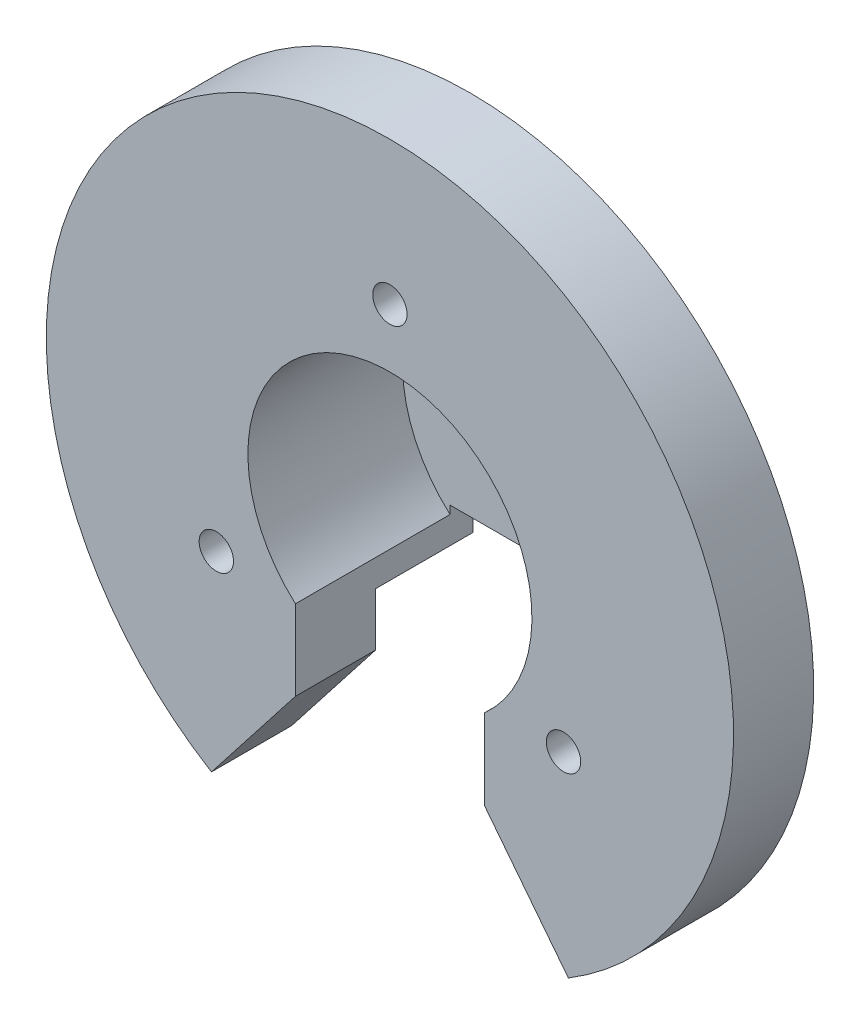
ISO-10303-21;
HEADER;
FILE_DESCRIPTION(('STEP AP214'),'2;1');
FILE_NAME('part.step','',(''),(''),'','','');
FILE_SCHEMA(('AUTOMOTIVE_DESIGN { 1 0 10303 214 1 1 1 1 }'));
ENDSEC;
DATA;
#1=APPLICATION_CONTEXT('core data for automotive mechanical design processes');
#2=APPLICATION_PROTOCOL_DEFINITION('international standard','automotive_design',2000,#1);
#3=PRODUCT_CONTEXT('',#1,'mechanical');
#4=PRODUCT('Part','Part','',(#3));
#5=PRODUCT_RELATED_PRODUCT_CATEGORY('part','',(#4));
#6=PRODUCT_DEFINITION_FORMATION('','',#4);
#7=PRODUCT_DEFINITION_CONTEXT('part definition',#1,'design');
#8=PRODUCT_DEFINITION('design','',#6,#7);
#9=PRODUCT_DEFINITION_SHAPE('','',#8);
#10=(LENGTH_UNIT() NAMED_UNIT(*) SI_UNIT(.MILLI.,.METRE.));
#11=(NAMED_UNIT(*) PLANE_ANGLE_UNIT() SI_UNIT($,.RADIAN.));
#12=(NAMED_UNIT(*) SI_UNIT($,.STERADIAN.) SOLID_ANGLE_UNIT());
#13=UNCERTAINTY_MEASURE_WITH_UNIT(LENGTH_MEASURE(1.E-05),#10,'distance_accuracy_value','');
#14=(GEOMETRIC_REPRESENTATION_CONTEXT(3) GLOBAL_UNCERTAINTY_ASSIGNED_CONTEXT((#13)) GLOBAL_UNIT_ASSIGNED_CONTEXT((#10,
#11,#12)) REPRESENTATION_CONTEXT('',''));
#15=CARTESIAN_POINT('',(0.,0.,0.));
#16=DIRECTION('',(0.,0.,1.));
#17=DIRECTION('',(1.,0.,0.));
#18=AXIS2_PLACEMENT_3D('',#15,#16,#17);
#19=CARTESIAN_POINT('',(0.,0.,13.5));
#20=DIRECTION('',(0.,0.,-1.));
#21=DIRECTION('',(-1.,0.,0.));
#22=AXIS2_PLACEMENT_3D('',#19,#20,#21);
#23=CYLINDRICAL_SURFACE('',#22,14.25);
#24=DIRECTION('',(0.,0.,-1.));
#25=VECTOR('',#24,1.);
#26=CARTESIAN_POINT('',(-8.25,-11.6189500386223,13.5));
#27=LINE('',#26,#25);
#28=CARTESIAN_POINT('',(-8.25,-11.6189500386223,6.5));
#29=VERTEX_POINT('',#28);
#30=CARTESIAN_POINT('',(-8.25,-11.6189500386223,-2.));
#31=VERTEX_POINT('',#30);
#32=EDGE_CURVE('E118',#29,#31,#27,.T.);
#33=ORIENTED_EDGE('',*,*,#32,.F.);
#34=CARTESIAN_POINT('',(0.,0.,6.5));
#35=DIRECTION('',(0.,0.,1.));
#36=DIRECTION('',(-1.,0.,0.));
#37=AXIS2_PLACEMENT_3D('',#34,#35,#36);
#38=CIRCLE('',#37,14.25);
#39=CARTESIAN_POINT('',(8.25,-11.6189500386223,6.5));
#40=VERTEX_POINT('',#39);
#41=EDGE_CURVE('E126',#40,#29,#38,.T.);
#42=ORIENTED_EDGE('',*,*,#41,.F.);
#43=DIRECTION('',(0.,0.,-1.));
#44=VECTOR('',#43,1.);
#45=CARTESIAN_POINT('',(8.25,-11.6189500386223,13.5));
#46=LINE('',#45,#44);
#47=CARTESIAN_POINT('',(8.25,-11.6189500386223,-2.));
#48=VERTEX_POINT('',#47);
#49=EDGE_CURVE('E159',#48,#40,#46,.F.);
#50=ORIENTED_EDGE('',*,*,#49,.F.);
#51=CARTESIAN_POINT('',(0.,0.,-2.));
#52=DIRECTION('',(0.,0.,-1.));
#53=DIRECTION('',(-1.,0.,0.));
#54=AXIS2_PLACEMENT_3D('',#51,#52,#53);
#55=CIRCLE('',#54,14.25);
#56=EDGE_CURVE('E141',#31,#48,#55,.T.);
#57=ORIENTED_EDGE('',*,*,#56,.F.);
#58=EDGE_LOOP('',(#33,#42,#50,#57));
#59=FACE_BOUND('',#58,.T.);
#60=ADVANCED_FACE('F40',(#59),#23,.T.);
#61=CARTESIAN_POINT('',(0.,0.,13.5));
#62=DIRECTION('',(0.,0.,1.));
#63=DIRECTION('',(1.,0.,0.));
#64=AXIS2_PLACEMENT_3D('',#61,#62,#63);
#65=PLANE('',#64);
#66=CARTESIAN_POINT('',(0.,17.5,13.5));
#67=DIRECTION('',(0.,0.,1.));
#68=DIRECTION('',(1.,0.,0.));
#69=AXIS2_PLACEMENT_3D('',#66,#67,#68);
#70=CIRCLE('',#69,1.5);
#71=CARTESIAN_POINT('',(1.5,17.5,13.5));
#72=VERTEX_POINT('',#71);
#73=EDGE_CURVE('E216',#72,#72,#70,.T.);
#74=ORIENTED_EDGE('',*,*,#73,.F.);
#75=EDGE_LOOP('',(#74));
#76=FACE_BOUND('',#75,.T.);
#77=CARTESIAN_POINT('',(15.1554445662288,-8.74999999999936,13.5));
#78=DIRECTION('',(0.,0.,1.));
#79=DIRECTION('',(1.,0.,0.));
#80=AXIS2_PLACEMENT_3D('',#77,#78,#79);
#81=CIRCLE('',#80,1.50000000000096);
#82=CARTESIAN_POINT('',(16.6554445662298,-8.74999999999936,13.5));
#83=VERTEX_POINT('',#82);
#84=EDGE_CURVE('E220',#83,#83,#81,.T.);
#85=ORIENTED_EDGE('',*,*,#84,.F.);
#86=EDGE_LOOP('',(#85));
#87=FACE_BOUND('',#86,.T.);
#88=CARTESIAN_POINT('',(-15.1554445662266,-8.75000000000065,13.5));
#89=DIRECTION('',(0.,0.,1.));
#90=DIRECTION('',(1.,0.,0.));
#91=AXIS2_PLACEMENT_3D('',#88,#89,#90);
#92=CIRCLE('',#91,1.50000000000141);
#93=CARTESIAN_POINT('',(-13.6554445662251,-8.75000000000065,13.5));
#94=VERTEX_POINT('',#93);
#95=EDGE_CURVE('E217',#94,#94,#92,.T.);
#96=ORIENTED_EDGE('',*,*,#95,.F.);
#97=EDGE_LOOP('',(#96));
#98=FACE_BOUND('',#97,.T.);
#99=DIRECTION('',(0.615661475325654,0.788010753606726,0.));
#100=VECTOR('',#99,1.);
#101=CARTESIAN_POINT('',(2.76358777565575,-2.15915140670948,13.5));
#102=LINE('',#101,#100);
#103=CARTESIAN_POINT('',(-15.5796183831118,-25.6373846372169,13.5));
#104=VERTEX_POINT('',#103);
#105=CARTESIAN_POINT('',(-8.25,-16.2559009205842,13.5));
#106=VERTEX_POINT('',#105);
#107=EDGE_CURVE('E143',#104,#106,#102,.T.);
#108=ORIENTED_EDGE('',*,*,#107,.T.);
#109=DIRECTION('',(0.,1.,0.));
#110=VECTOR('',#109,1.);
#111=CARTESIAN_POINT('',(-8.25,0.,13.5));
#112=LINE('',#111,#110);
#113=CARTESIAN_POINT('',(-8.25,-9.25729442115784,13.5));
#114=VERTEX_POINT('',#113);
#115=EDGE_CURVE('E156',#106,#114,#112,.T.);
#116=ORIENTED_EDGE('',*,*,#115,.T.);
#117=CARTESIAN_POINT('',(0.,0.,13.5));
#118=DIRECTION('',(0.,0.,1.));
#119=DIRECTION('',(1.,0.,0.));
#120=AXIS2_PLACEMENT_3D('',#117,#118,#119);
#121=CIRCLE('',#120,12.4);
#122=CARTESIAN_POINT('',(8.25,-9.25729442115784,13.5));
#123=VERTEX_POINT('',#122);
#124=EDGE_CURVE('E187',#123,#114,#121,.T.);
#125=ORIENTED_EDGE('',*,*,#124,.F.);
#126=DIRECTION('',(0.,-1.,0.));
#127=VECTOR('',#126,1.);
#128=CARTESIAN_POINT('',(8.25,0.,13.5));
#129=LINE('',#128,#127);
#130=CARTESIAN_POINT('',(8.25,-16.2559009205842,13.5));
#131=VERTEX_POINT('',#130);
#132=EDGE_CURVE('E54',#123,#131,#129,.T.);
#133=ORIENTED_EDGE('',*,*,#132,.T.);
#134=DIRECTION('',(0.61566147532566,-0.788010753606721,0.));
#135=VECTOR('',#134,1.);
#136=CARTESIAN_POINT('',(-2.76358777565584,-2.15915140670958,13.5));
#137=LINE('',#136,#135);
#138=CARTESIAN_POINT('',(15.5796183831119,-25.6373846372168,13.5));
#139=VERTEX_POINT('',#138);
#140=EDGE_CURVE('E148',#131,#139,#137,.T.);
#141=ORIENTED_EDGE('',*,*,#140,.T.);
#142=CARTESIAN_POINT('',(0.,0.,13.5));
#143=DIRECTION('',(0.,0.,1.));
#144=DIRECTION('',(1.,0.,0.));
#145=AXIS2_PLACEMENT_3D('',#142,#143,#144);
#146=CIRCLE('',#145,30.);
#147=EDGE_CURVE('E170',#139,#104,#146,.T.);
#148=ORIENTED_EDGE('',*,*,#147,.T.);
#149=EDGE_LOOP('',(#108,#116,#125,#133,#141,#148));
#150=FACE_BOUND('',#149,.T.);
#151=ADVANCED_FACE('F203',(#76,#87,#98,#150),#65,.T.);
#152=CARTESIAN_POINT('',(0.,0.,13.5));
#153=DIRECTION('',(0.,0.,-1.));
#154=DIRECTION('',(-1.,0.,0.));
#155=AXIS2_PLACEMENT_3D('',#152,#153,#154);
#156=CYLINDRICAL_SURFACE('',#155,12.4);
#157=CARTESIAN_POINT('',(0.,0.,0.));
#158=DIRECTION('',(0.,0.,1.));
#159=DIRECTION('',(1.,0.,0.));
#160=AXIS2_PLACEMENT_3D('',#157,#158,#159);
#161=CIRCLE('',#160,12.4);
#162=CARTESIAN_POINT('',(8.25,-9.25729442115784,0.));
#163=VERTEX_POINT('',#162);
#164=CARTESIAN_POINT('',(-8.25,-9.25729442115784,0.));
#165=VERTEX_POINT('',#164);
#166=EDGE_CURVE('E182',#163,#165,#161,.T.);
#167=ORIENTED_EDGE('',*,*,#166,.F.);
#168=DIRECTION('',(0.,0.,-1.));
#169=VECTOR('',#168,1.);
#170=CARTESIAN_POINT('',(8.25,-9.25729442115784,13.5));
#171=LINE('',#170,#169);
#172=EDGE_CURVE('E58',#163,#123,#171,.F.);
#173=ORIENTED_EDGE('',*,*,#172,.T.);
#174=ORIENTED_EDGE('',*,*,#124,.T.);
#175=DIRECTION('',(0.,0.,-1.));
#176=VECTOR('',#175,1.);
#177=CARTESIAN_POINT('',(-8.25,-9.25729442115784,13.5));
#178=LINE('',#177,#176);
#179=EDGE_CURVE('E153',#114,#165,#178,.T.);
#180=ORIENTED_EDGE('',*,*,#179,.T.);
#181=EDGE_LOOP('',(#167,#173,#174,#180));
#182=FACE_BOUND('',#181,.T.);
#183=ADVANCED_FACE('F256',(#182),#156,.F.);
#184=CARTESIAN_POINT('',(0.,0.,0.));
#185=DIRECTION('',(0.,0.,-1.));
#186=DIRECTION('',(-1.,0.,0.));
#187=AXIS2_PLACEMENT_3D('',#184,#185,#186);
#188=PLANE('',#187);
#189=CARTESIAN_POINT('',(10.,0.,0.));
#190=DIRECTION('',(0.,0.,-1.));
#191=DIRECTION('',(-1.,0.,0.));
#192=AXIS2_PLACEMENT_3D('',#189,#190,#191);
#193=CIRCLE('',#192,1.5);
#194=CARTESIAN_POINT('',(8.5,0.,0.));
#195=VERTEX_POINT('',#194);
#196=EDGE_CURVE('E173',#195,#195,#193,.T.);
#197=ORIENTED_EDGE('',*,*,#196,.T.);
#198=EDGE_LOOP('',(#197));
#199=FACE_BOUND('',#198,.T.);
#200=CARTESIAN_POINT('',(0.,0.,0.));
#201=DIRECTION('',(0.,0.,-1.));
#202=DIRECTION('',(-1.,0.,0.));
#203=AXIS2_PLACEMENT_3D('',#200,#201,#202);
#204=CIRCLE('',#203,4.5);
#205=CARTESIAN_POINT('',(-4.5,0.,0.));
#206=VERTEX_POINT('',#205);
#207=EDGE_CURVE('E176',#206,#206,#204,.T.);
#208=ORIENTED_EDGE('',*,*,#207,.T.);
#209=EDGE_LOOP('',(#208));
#210=FACE_BOUND('',#209,.T.);
#211=DIRECTION('',(0.,1.,0.));
#212=VECTOR('',#211,1.);
#213=CARTESIAN_POINT('',(8.25,0.,0.));
#214=LINE('',#213,#212);
#215=CARTESIAN_POINT('',(8.25,-8.54409907941579,0.));
#216=VERTEX_POINT('',#215);
#217=EDGE_CURVE('E164',#163,#216,#214,.T.);
#218=ORIENTED_EDGE('',*,*,#217,.F.);
#219=ORIENTED_EDGE('',*,*,#166,.T.);
#220=DIRECTION('',(0.,-1.,0.));
#221=VECTOR('',#220,1.);
#222=CARTESIAN_POINT('',(-8.25,0.,0.));
#223=LINE('',#222,#221);
#224=CARTESIAN_POINT('',(-8.25,-8.54409907941579,0.));
#225=VERTEX_POINT('',#224);
#226=EDGE_CURVE('E145',#225,#165,#223,.T.);
#227=ORIENTED_EDGE('',*,*,#226,.F.);
#228=DIRECTION('',(-1.,0.,0.));
#229=VECTOR('',#228,1.);
#230=CARTESIAN_POINT('',(0.,-8.54409907941579,0.));
#231=LINE('',#230,#229);
#232=EDGE_CURVE('E168',#216,#225,#231,.T.);
#233=ORIENTED_EDGE('',*,*,#232,.F.);
#234=EDGE_LOOP('',(#218,#219,#227,#233));
#235=FACE_BOUND('',#234,.T.);
#236=ADVANCED_FACE('F261',(#199,#210,#235),#188,.F.);
#237=CARTESIAN_POINT('',(0.,0.,-2.));
#238=DIRECTION('',(0.,0.,-1.));
#239=DIRECTION('',(-1.,0.,0.));
#240=AXIS2_PLACEMENT_3D('',#237,#238,#239);
#241=PLANE('',#240);
#242=CARTESIAN_POINT('',(10.,0.,-2.));
#243=DIRECTION('',(0.,0.,-1.));
#244=DIRECTION('',(-1.,0.,0.));
#245=AXIS2_PLACEMENT_3D('',#242,#243,#244);
#246=CIRCLE('',#245,1.5);
#247=CARTESIAN_POINT('',(8.5,0.,-2.));
#248=VERTEX_POINT('',#247);
#249=EDGE_CURVE('E175',#248,#248,#246,.T.);
#250=ORIENTED_EDGE('',*,*,#249,.F.);
#251=EDGE_LOOP('',(#250));
#252=FACE_BOUND('',#251,.T.);
#253=CARTESIAN_POINT('',(0.,0.,-2.));
#254=DIRECTION('',(0.,0.,-1.));
#255=DIRECTION('',(-1.,0.,0.));
#256=AXIS2_PLACEMENT_3D('',#253,#254,#255);
#257=CIRCLE('',#256,4.5);
#258=CARTESIAN_POINT('',(-4.5,0.,-2.));
#259=VERTEX_POINT('',#258);
#260=EDGE_CURVE('E179',#259,#259,#257,.T.);
#261=ORIENTED_EDGE('',*,*,#260,.F.);
#262=EDGE_LOOP('',(#261));
#263=FACE_BOUND('',#262,.T.);
#264=ORIENTED_EDGE('',*,*,#56,.T.);
#265=DIRECTION('',(0.,1.,0.));
#266=VECTOR('',#265,1.);
#267=CARTESIAN_POINT('',(8.25,0.,-2.));
#268=LINE('',#267,#266);
#269=CARTESIAN_POINT('',(8.25,-8.54409907941579,-2.));
#270=VERTEX_POINT('',#269);
#271=EDGE_CURVE('E161',#48,#270,#268,.T.);
#272=ORIENTED_EDGE('',*,*,#271,.T.);
#273=DIRECTION('',(-1.,0.,0.));
#274=VECTOR('',#273,1.);
#275=CARTESIAN_POINT('',(0.,-8.54409907941579,-2.));
#276=LINE('',#275,#274);
#277=CARTESIAN_POINT('',(-8.25,-8.54409907941579,-2.));
#278=VERTEX_POINT('',#277);
#279=EDGE_CURVE('E11',#270,#278,#276,.T.);
#280=ORIENTED_EDGE('',*,*,#279,.T.);
#281=DIRECTION('',(0.,-1.,0.));
#282=VECTOR('',#281,1.);
#283=CARTESIAN_POINT('',(-8.25,0.,-2.));
#284=LINE('',#283,#282);
#285=EDGE_CURVE('E142',#278,#31,#284,.T.);
#286=ORIENTED_EDGE('',*,*,#285,.T.);
#287=EDGE_LOOP('',(#264,#272,#280,#286));
#288=FACE_BOUND('',#287,.T.);
#289=ADVANCED_FACE('F278',(#252,#263,#288),#241,.T.);
#290=CARTESIAN_POINT('',(0.,0.,11.5));
#291=DIRECTION('',(0.,0.,1.));
#292=DIRECTION('',(1.,0.,0.));
#293=AXIS2_PLACEMENT_3D('',#290,#291,#292);
#294=CYLINDRICAL_SURFACE('',#293,30.);
#295=DIRECTION('',(0.,0.,1.));
#296=VECTOR('',#295,1.);
#297=CARTESIAN_POINT('',(15.5796183831119,-25.6373846372168,11.5));
#298=LINE('',#297,#296);
#299=CARTESIAN_POINT('',(15.5796183831119,-25.6373846372168,6.5));
#300=VERTEX_POINT('',#299);
#301=EDGE_CURVE('E190',#139,#300,#298,.F.);
#302=ORIENTED_EDGE('',*,*,#301,.T.);
#303=CARTESIAN_POINT('',(0.,0.,6.5));
#304=DIRECTION('',(0.,0.,-1.));
#305=DIRECTION('',(-1.,0.,0.));
#306=AXIS2_PLACEMENT_3D('',#303,#304,#305);
#307=CIRCLE('',#306,30.);
#308=CARTESIAN_POINT('',(-15.5796183831118,-25.6373846372169,6.5));
#309=VERTEX_POINT('',#308);
#310=EDGE_CURVE('E199',#309,#300,#307,.T.);
#311=ORIENTED_EDGE('',*,*,#310,.F.);
#312=DIRECTION('',(0.,0.,1.));
#313=VECTOR('',#312,1.);
#314=CARTESIAN_POINT('',(-15.5796183831118,-25.6373846372169,11.5));
#315=LINE('',#314,#313);
#316=EDGE_CURVE('E47',#309,#104,#315,.T.);
#317=ORIENTED_EDGE('',*,*,#316,.T.);
#318=ORIENTED_EDGE('',*,*,#147,.F.);
#319=EDGE_LOOP('',(#302,#311,#317,#318));
#320=FACE_BOUND('',#319,.T.);
#321=ADVANCED_FACE('F197',(#320),#294,.T.);
#322=CARTESIAN_POINT('',(10.,0.,-2.));
#323=DIRECTION('',(0.,0.,1.));
#324=DIRECTION('',(1.,0.,0.));
#325=AXIS2_PLACEMENT_3D('',#322,#323,#324);
#326=CYLINDRICAL_SURFACE('',#325,1.5);
#327=ORIENTED_EDGE('',*,*,#249,.T.);
#328=EDGE_LOOP('',(#327));
#329=FACE_BOUND('',#328,.T.);
#330=ORIENTED_EDGE('',*,*,#196,.F.);
#331=EDGE_LOOP('',(#330));
#332=FACE_BOUND('',#331,.T.);
#333=ADVANCED_FACE('F267',(#329,#332),#326,.F.);
#334=CARTESIAN_POINT('',(0.,0.,-2.));
#335=DIRECTION('',(0.,0.,1.));
#336=DIRECTION('',(1.,0.,0.));
#337=AXIS2_PLACEMENT_3D('',#334,#335,#336);
#338=CYLINDRICAL_SURFACE('',#337,4.5);
#339=ORIENTED_EDGE('',*,*,#260,.T.);
#340=EDGE_LOOP('',(#339));
#341=FACE_BOUND('',#340,.T.);
#342=ORIENTED_EDGE('',*,*,#207,.F.);
#343=EDGE_LOOP('',(#342));
#344=FACE_BOUND('',#343,.T.);
#345=ADVANCED_FACE('F270',(#341,#344),#338,.F.);
#346=CARTESIAN_POINT('',(-8.25,-8.54409907941579,15.5));
#347=DIRECTION('',(0.,-1.,0.));
#348=DIRECTION('',(0.,0.,-1.));
#349=AXIS2_PLACEMENT_3D('',#346,#347,#348);
#350=PLANE('',#349);
#351=ORIENTED_EDGE('',*,*,#232,.T.);
#352=DIRECTION('',(0.,0.,-1.));
#353=VECTOR('',#352,1.);
#354=CARTESIAN_POINT('',(-8.25,-8.54409907941579,15.5));
#355=LINE('',#354,#353);
#356=EDGE_CURVE('E208',#225,#278,#355,.T.);
#357=ORIENTED_EDGE('',*,*,#356,.T.);
#358=ORIENTED_EDGE('',*,*,#279,.F.);
#359=DIRECTION('',(0.,0.,-1.));
#360=VECTOR('',#359,1.);
#361=CARTESIAN_POINT('',(8.25,-8.54409907941579,15.5));
#362=LINE('',#361,#360);
#363=EDGE_CURVE('E206',#216,#270,#362,.T.);
#364=ORIENTED_EDGE('',*,*,#363,.F.);
#365=EDGE_LOOP('',(#351,#357,#358,#364));
#366=FACE_BOUND('',#365,.T.);
#367=ADVANCED_FACE('F274',(#366),#350,.T.);
#368=CARTESIAN_POINT('',(-8.25,-16.2559009205842,15.5));
#369=DIRECTION('',(0.788010753606726,-0.615661475325654,0.));
#370=DIRECTION('',(0.615661475325654,0.788010753606726,0.));
#371=AXIS2_PLACEMENT_3D('',#368,#369,#370);
#372=PLANE('',#371);
#373=ORIENTED_EDGE('',*,*,#316,.F.);
#374=DIRECTION('',(-0.615661475325654,-0.788010753606726,0.));
#375=VECTOR('',#374,1.);
#376=CARTESIAN_POINT('',(-8.25,-16.2559009205842,6.5));
#377=LINE('',#376,#375);
#378=CARTESIAN_POINT('',(-8.25,-16.2559009205842,6.5));
#379=VERTEX_POINT('',#378);
#380=EDGE_CURVE('E125',#379,#309,#377,.T.);
#381=ORIENTED_EDGE('',*,*,#380,.F.);
#382=DIRECTION('',(0.,0.,-1.));
#383=VECTOR('',#382,1.);
#384=CARTESIAN_POINT('',(-8.25,-16.2559009205842,15.5));
#385=LINE('',#384,#383);
#386=EDGE_CURVE('E121',#106,#379,#385,.T.);
#387=ORIENTED_EDGE('',*,*,#386,.F.);
#388=ORIENTED_EDGE('',*,*,#107,.F.);
#389=EDGE_LOOP('',(#373,#381,#387,#388));
#390=FACE_BOUND('',#389,.T.);
#391=ADVANCED_FACE('F288',(#390),#372,.T.);
#392=CARTESIAN_POINT('',(8.25,-16.2559009205842,15.5));
#393=DIRECTION('',(-1.,0.,0.));
#394=DIRECTION('',(0.,0.,1.));
#395=AXIS2_PLACEMENT_3D('',#392,#393,#394);
#396=PLANE('',#395);
#397=DIRECTION('',(0.,1.,0.));
#398=VECTOR('',#397,1.);
#399=CARTESIAN_POINT('',(8.25,-16.2559009205842,6.5));
#400=LINE('',#399,#398);
#401=CARTESIAN_POINT('',(8.25,-16.2559009205842,6.5));
#402=VERTEX_POINT('',#401);
#403=EDGE_CURVE('E133',#402,#40,#400,.T.);
#404=ORIENTED_EDGE('',*,*,#403,.F.);
#405=DIRECTION('',(0.,0.,-1.));
#406=VECTOR('',#405,1.);
#407=CARTESIAN_POINT('',(8.25,-16.2559009205842,15.5));
#408=LINE('',#407,#406);
#409=EDGE_CURVE('E214',#131,#402,#408,.T.);
#410=ORIENTED_EDGE('',*,*,#409,.F.);
#411=ORIENTED_EDGE('',*,*,#132,.F.);
#412=ORIENTED_EDGE('',*,*,#172,.F.);
#413=ORIENTED_EDGE('',*,*,#217,.T.);
#414=ORIENTED_EDGE('',*,*,#363,.T.);
#415=ORIENTED_EDGE('',*,*,#271,.F.);
#416=ORIENTED_EDGE('',*,*,#49,.T.);
#417=EDGE_LOOP('',(#404,#410,#411,#412,#413,#414,#415,#416));
#418=FACE_BOUND('',#417,.T.);
#419=ADVANCED_FACE('F285',(#418),#396,.T.);
#420=CARTESIAN_POINT('',(-8.25,-16.2559009205842,15.5));
#421=DIRECTION('',(1.,0.,0.));
#422=DIRECTION('',(0.,0.,-1.));
#423=AXIS2_PLACEMENT_3D('',#420,#421,#422);
#424=PLANE('',#423);
#425=ORIENTED_EDGE('',*,*,#386,.T.);
#426=DIRECTION('',(0.,-1.,0.));
#427=VECTOR('',#426,1.);
#428=CARTESIAN_POINT('',(-8.25,-11.6189500386223,6.5));
#429=LINE('',#428,#427);
#430=EDGE_CURVE('E114',#29,#379,#429,.T.);
#431=ORIENTED_EDGE('',*,*,#430,.F.);
#432=ORIENTED_EDGE('',*,*,#32,.T.);
#433=ORIENTED_EDGE('',*,*,#285,.F.);
#434=ORIENTED_EDGE('',*,*,#356,.F.);
#435=ORIENTED_EDGE('',*,*,#226,.T.);
#436=ORIENTED_EDGE('',*,*,#179,.F.);
#437=ORIENTED_EDGE('',*,*,#115,.F.);
#438=EDGE_LOOP('',(#425,#431,#432,#433,#434,#435,#436,#437));
#439=FACE_BOUND('',#438,.T.);
#440=ADVANCED_FACE('F116',(#439),#424,.T.);
#441=CARTESIAN_POINT('',(18.383281344227,-29.2259095837857,15.5));
#442=DIRECTION('',(-0.788010753606721,-0.61566147532566,0.));
#443=DIRECTION('',(0.61566147532566,-0.788010753606721,0.));
#444=AXIS2_PLACEMENT_3D('',#441,#442,#443);
#445=PLANE('',#444);
#446=ORIENTED_EDGE('',*,*,#409,.T.);
#447=DIRECTION('',(-0.615661475325661,0.78801075360672,0.));
#448=VECTOR('',#447,1.);
#449=CARTESIAN_POINT('',(15.5796183831119,-25.6373846372168,6.5));
#450=LINE('',#449,#448);
#451=EDGE_CURVE('E226',#300,#402,#450,.T.);
#452=ORIENTED_EDGE('',*,*,#451,.F.);
#453=ORIENTED_EDGE('',*,*,#301,.F.);
#454=ORIENTED_EDGE('',*,*,#140,.F.);
#455=EDGE_LOOP('',(#446,#452,#453,#454));
#456=FACE_BOUND('',#455,.T.);
#457=ADVANCED_FACE('F294',(#456),#445,.T.);
#458=CARTESIAN_POINT('',(-15.1554445662266,-8.75000000000065,11.5));
#459=DIRECTION('',(0.,0.,1.));
#460=DIRECTION('',(1.,0.,0.));
#461=AXIS2_PLACEMENT_3D('',#458,#459,#460);
#462=CYLINDRICAL_SURFACE('',#461,1.50000000000141);
#463=ORIENTED_EDGE('',*,*,#95,.T.);
#464=EDGE_LOOP('',(#463));
#465=FACE_BOUND('',#464,.T.);
#466=CARTESIAN_POINT('',(-15.1554445662266,-8.75000000000065,6.5));
#467=DIRECTION('',(0.,0.,-1.));
#468=DIRECTION('',(-1.,0.,0.));
#469=AXIS2_PLACEMENT_3D('',#466,#467,#468);
#470=CIRCLE('',#469,1.50000000000141);
#471=CARTESIAN_POINT('',(-16.655444566228,-8.75000000000065,6.5));
#472=VERTEX_POINT('',#471);
#473=EDGE_CURVE('E235',#472,#472,#470,.T.);
#474=ORIENTED_EDGE('',*,*,#473,.T.);
#475=EDGE_LOOP('',(#474));
#476=FACE_BOUND('',#475,.T.);
#477=ADVANCED_FACE('F239',(#465,#476),#462,.F.);
#478=CARTESIAN_POINT('',(15.1554445662288,-8.74999999999936,11.5));
#479=DIRECTION('',(0.,0.,1.));
#480=DIRECTION('',(1.,0.,0.));
#481=AXIS2_PLACEMENT_3D('',#478,#479,#480);
#482=CYLINDRICAL_SURFACE('',#481,1.50000000000096);
#483=ORIENTED_EDGE('',*,*,#84,.T.);
#484=EDGE_LOOP('',(#483));
#485=FACE_BOUND('',#484,.T.);
#486=CARTESIAN_POINT('',(15.1554445662288,-8.74999999999936,6.5));
#487=DIRECTION('',(0.,0.,-1.));
#488=DIRECTION('',(-1.,0.,0.));
#489=AXIS2_PLACEMENT_3D('',#486,#487,#488);
#490=CIRCLE('',#489,1.50000000000096);
#491=CARTESIAN_POINT('',(13.6554445662278,-8.74999999999936,6.5));
#492=VERTEX_POINT('',#491);
#493=EDGE_CURVE('E232',#492,#492,#490,.T.);
#494=ORIENTED_EDGE('',*,*,#493,.T.);
#495=EDGE_LOOP('',(#494));
#496=FACE_BOUND('',#495,.T.);
#497=ADVANCED_FACE('F248',(#485,#496),#482,.F.);
#498=CARTESIAN_POINT('',(0.,17.5,11.5));
#499=DIRECTION('',(0.,0.,1.));
#500=DIRECTION('',(1.,0.,0.));
#501=AXIS2_PLACEMENT_3D('',#498,#499,#500);
#502=CYLINDRICAL_SURFACE('',#501,1.5);
#503=ORIENTED_EDGE('',*,*,#73,.T.);
#504=EDGE_LOOP('',(#503));
#505=FACE_BOUND('',#504,.T.);
#506=CARTESIAN_POINT('',(0.,17.5,6.5));
#507=DIRECTION('',(0.,0.,-1.));
#508=DIRECTION('',(-1.,0.,0.));
#509=AXIS2_PLACEMENT_3D('',#506,#507,#508);
#510=CIRCLE('',#509,1.5);
#511=CARTESIAN_POINT('',(-1.5,17.5,6.5));
#512=VERTEX_POINT('',#511);
#513=EDGE_CURVE('E137',#512,#512,#510,.T.);
#514=ORIENTED_EDGE('',*,*,#513,.T.);
#515=EDGE_LOOP('',(#514));
#516=FACE_BOUND('',#515,.T.);
#517=ADVANCED_FACE('F242',(#505,#516),#502,.F.);
#518=CARTESIAN_POINT('',(0.,0.,6.5));
#519=DIRECTION('',(0.,0.,-1.));
#520=DIRECTION('',(-1.,0.,0.));
#521=AXIS2_PLACEMENT_3D('',#518,#519,#520);
#522=PLANE('',#521);
#523=ORIENTED_EDGE('',*,*,#493,.F.);
#524=EDGE_LOOP('',(#523));
#525=FACE_BOUND('',#524,.T.);
#526=ORIENTED_EDGE('',*,*,#41,.T.);
#527=ORIENTED_EDGE('',*,*,#430,.T.);
#528=ORIENTED_EDGE('',*,*,#380,.T.);
#529=ORIENTED_EDGE('',*,*,#310,.T.);
#530=ORIENTED_EDGE('',*,*,#451,.T.);
#531=ORIENTED_EDGE('',*,*,#403,.T.);
#532=EDGE_LOOP('',(#526,#527,#528,#529,#530,#531));
#533=FACE_BOUND('',#532,.T.);
#534=ORIENTED_EDGE('',*,*,#513,.F.);
#535=EDGE_LOOP('',(#534));
#536=FACE_BOUND('',#535,.T.);
#537=ORIENTED_EDGE('',*,*,#473,.F.);
#538=EDGE_LOOP('',(#537));
#539=FACE_BOUND('',#538,.T.);
#540=ADVANCED_FACE('F129',(#525,#533,#536,#539),#522,.T.);
#541=CLOSED_SHELL('',(#60,#151,#183,#236,#289,#321,#333,#345,#367,#391,#419,#440,#457,#477,#497,
#517,#540));
#542=MANIFOLD_SOLID_BREP('B2',#541);
#543=ADVANCED_BREP_SHAPE_REPRESENTATION('',(#18,#542),#14);
#544=SHAPE_DEFINITION_REPRESENTATION(#9,#543);
ENDSEC;
END-ISO-10303-21;
